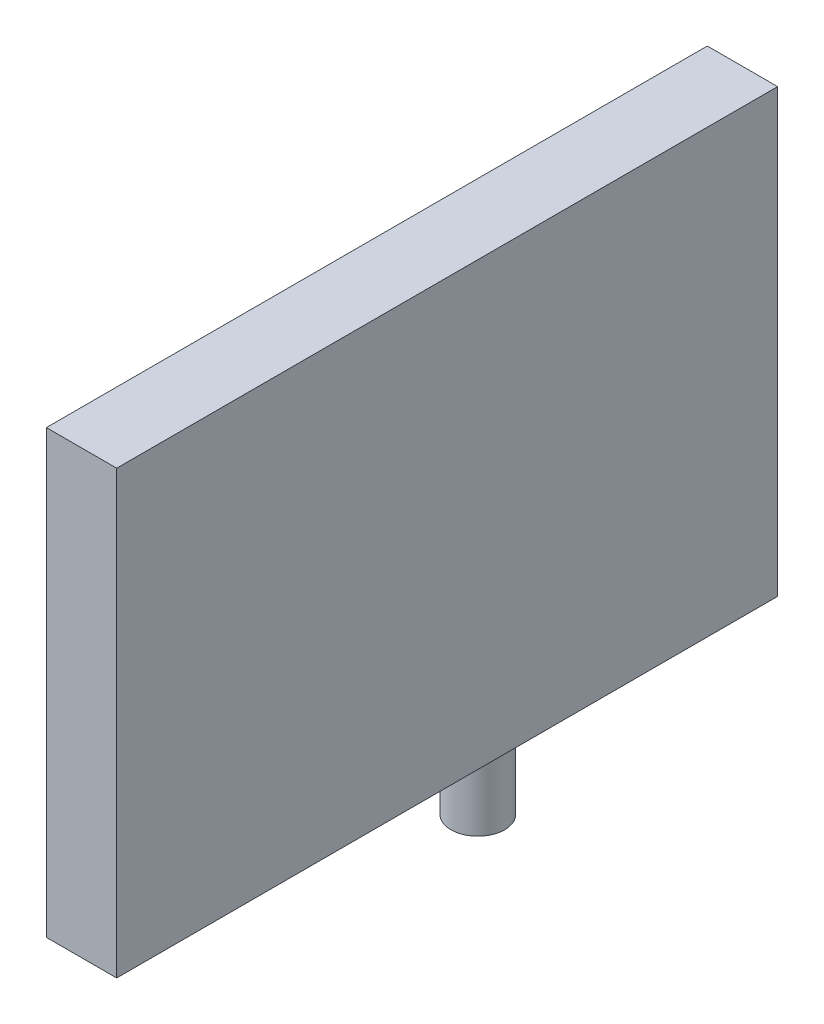
ISO-10303-21;
HEADER;
FILE_DESCRIPTION(('STEP AP214'),'2;1');
FILE_NAME('part.step','',(''),(''),'','','');
FILE_SCHEMA(('AUTOMOTIVE_DESIGN { 1 0 10303 214 1 1 1 1 }'));
ENDSEC;
DATA;
#1=APPLICATION_CONTEXT('core data for automotive mechanical design processes');
#2=APPLICATION_PROTOCOL_DEFINITION('international standard','automotive_design',2000,#1);
#3=PRODUCT_CONTEXT('',#1,'mechanical');
#4=PRODUCT('Part','Part','',(#3));
#5=PRODUCT_RELATED_PRODUCT_CATEGORY('part','',(#4));
#6=PRODUCT_DEFINITION_FORMATION('','',#4);
#7=PRODUCT_DEFINITION_CONTEXT('part definition',#1,'design');
#8=PRODUCT_DEFINITION('design','',#6,#7);
#9=PRODUCT_DEFINITION_SHAPE('','',#8);
#10=(LENGTH_UNIT() NAMED_UNIT(*) SI_UNIT(.MILLI.,.METRE.));
#11=(NAMED_UNIT(*) PLANE_ANGLE_UNIT() SI_UNIT($,.RADIAN.));
#12=(NAMED_UNIT(*) SI_UNIT($,.STERADIAN.) SOLID_ANGLE_UNIT());
#13=UNCERTAINTY_MEASURE_WITH_UNIT(LENGTH_MEASURE(1.E-05),#10,'distance_accuracy_value','');
#14=(GEOMETRIC_REPRESENTATION_CONTEXT(3) GLOBAL_UNCERTAINTY_ASSIGNED_CONTEXT((#13)) GLOBAL_UNIT_ASSIGNED_CONTEXT((#10,
#11,#12)) REPRESENTATION_CONTEXT('',''));
#15=CARTESIAN_POINT('',(0.,0.,0.));
#16=DIRECTION('',(0.,0.,1.));
#17=DIRECTION('',(1.,0.,0.));
#18=AXIS2_PLACEMENT_3D('',#15,#16,#17);
#19=CARTESIAN_POINT('',(10.,31.3958167330677,-46.9980100370033));
#20=DIRECTION('',(0.,0.,1.));
#21=DIRECTION('',(1.,0.,0.));
#22=AXIS2_PLACEMENT_3D('',#19,#20,#21);
#23=PLANE('',#22);
#24=DIRECTION('',(0.,1.,0.));
#25=VECTOR('',#24,1.);
#26=CARTESIAN_POINT('',(0.,31.3958167330677,-46.9980100370033));
#27=LINE('',#26,#25);
#28=CARTESIAN_POINT('',(0.,-31.3958167330677,-46.9980100370033));
#29=VERTEX_POINT('',#28);
#30=CARTESIAN_POINT('',(0.,31.3958167330677,-46.9980100370033));
#31=VERTEX_POINT('',#30);
#32=EDGE_CURVE('E99',#29,#31,#27,.T.);
#33=ORIENTED_EDGE('',*,*,#32,.T.);
#34=DIRECTION('',(-1.,0.,0.));
#35=VECTOR('',#34,1.);
#36=CARTESIAN_POINT('',(10.,31.3958167330677,-46.9980100370033));
#37=LINE('',#36,#35);
#38=CARTESIAN_POINT('',(10.,31.3958167330677,-46.9980100370033));
#39=VERTEX_POINT('',#38);
#40=EDGE_CURVE('E41',#39,#31,#37,.T.);
#41=ORIENTED_EDGE('',*,*,#40,.F.);
#42=DIRECTION('',(0.,1.,0.));
#43=VECTOR('',#42,1.);
#44=CARTESIAN_POINT('',(10.,31.3958167330677,-46.9980100370033));
#45=LINE('',#44,#43);
#46=CARTESIAN_POINT('',(10.,-31.3958167330677,-46.9980100370033));
#47=VERTEX_POINT('',#46);
#48=EDGE_CURVE('E85',#47,#39,#45,.T.);
#49=ORIENTED_EDGE('',*,*,#48,.F.);
#50=DIRECTION('',(-1.,0.,0.));
#51=VECTOR('',#50,1.);
#52=CARTESIAN_POINT('',(10.,-31.3958167330677,-46.9980100370033));
#53=LINE('',#52,#51);
#54=EDGE_CURVE('E95',#47,#29,#53,.T.);
#55=ORIENTED_EDGE('',*,*,#54,.T.);
#56=EDGE_LOOP('',(#33,#41,#49,#55));
#57=FACE_BOUND('',#56,.T.);
#58=ADVANCED_FACE('F33',(#57),#23,.F.);
#59=CARTESIAN_POINT('',(10.,31.3958167330677,46.9980100370033));
#60=DIRECTION('',(0.,-1.,0.));
#61=DIRECTION('',(0.,0.,-1.));
#62=AXIS2_PLACEMENT_3D('',#59,#60,#61);
#63=PLANE('',#62);
#64=DIRECTION('',(0.,0.,1.));
#65=VECTOR('',#64,1.);
#66=CARTESIAN_POINT('',(0.,31.3958167330677,46.9980100370033));
#67=LINE('',#66,#65);
#68=CARTESIAN_POINT('',(0.,31.3958167330677,46.9980100370033));
#69=VERTEX_POINT('',#68);
#70=EDGE_CURVE('E90',#31,#69,#67,.T.);
#71=ORIENTED_EDGE('',*,*,#70,.T.);
#72=DIRECTION('',(-1.,0.,0.));
#73=VECTOR('',#72,1.);
#74=CARTESIAN_POINT('',(10.,31.3958167330677,46.9980100370033));
#75=LINE('',#74,#73);
#76=CARTESIAN_POINT('',(10.,31.3958167330677,46.9980100370033));
#77=VERTEX_POINT('',#76);
#78=EDGE_CURVE('E88',#77,#69,#75,.T.);
#79=ORIENTED_EDGE('',*,*,#78,.F.);
#80=DIRECTION('',(0.,0.,1.));
#81=VECTOR('',#80,1.);
#82=CARTESIAN_POINT('',(10.,31.3958167330677,46.9980100370033));
#83=LINE('',#82,#81);
#84=EDGE_CURVE('E80',#39,#77,#83,.T.);
#85=ORIENTED_EDGE('',*,*,#84,.F.);
#86=ORIENTED_EDGE('',*,*,#40,.T.);
#87=EDGE_LOOP('',(#71,#79,#85,#86));
#88=FACE_BOUND('',#87,.T.);
#89=ADVANCED_FACE('F89',(#88),#63,.F.);
#90=CARTESIAN_POINT('',(10.,31.3958167330677,46.9980100370033));
#91=DIRECTION('',(0.,0.,-1.));
#92=DIRECTION('',(-1.,0.,0.));
#93=AXIS2_PLACEMENT_3D('',#90,#91,#92);
#94=PLANE('',#93);
#95=DIRECTION('',(0.,-1.,0.));
#96=VECTOR('',#95,1.);
#97=CARTESIAN_POINT('',(0.,31.3958167330677,46.9980100370033));
#98=LINE('',#97,#96);
#99=CARTESIAN_POINT('',(0.,-31.3958167330677,46.9980100370033));
#100=VERTEX_POINT('',#99);
#101=EDGE_CURVE('E66',#69,#100,#98,.T.);
#102=ORIENTED_EDGE('',*,*,#101,.T.);
#103=DIRECTION('',(-1.,0.,0.));
#104=VECTOR('',#103,1.);
#105=CARTESIAN_POINT('',(10.,-31.3958167330677,46.9980100370033));
#106=LINE('',#105,#104);
#107=CARTESIAN_POINT('',(10.,-31.3958167330677,46.9980100370033));
#108=VERTEX_POINT('',#107);
#109=EDGE_CURVE('E91',#108,#100,#106,.T.);
#110=ORIENTED_EDGE('',*,*,#109,.F.);
#111=DIRECTION('',(0.,-1.,0.));
#112=VECTOR('',#111,1.);
#113=CARTESIAN_POINT('',(10.,31.3958167330677,46.9980100370033));
#114=LINE('',#113,#112);
#115=EDGE_CURVE('E83',#77,#108,#114,.T.);
#116=ORIENTED_EDGE('',*,*,#115,.F.);
#117=ORIENTED_EDGE('',*,*,#78,.T.);
#118=EDGE_LOOP('',(#102,#110,#116,#117));
#119=FACE_BOUND('',#118,.T.);
#120=ADVANCED_FACE('F93',(#119),#94,.F.);
#121=CARTESIAN_POINT('',(10.,-31.3958167330677,46.9980100370033));
#122=DIRECTION('',(0.,1.,0.));
#123=DIRECTION('',(0.,0.,1.));
#124=AXIS2_PLACEMENT_3D('',#121,#122,#123);
#125=PLANE('',#124);
#126=CARTESIAN_POINT('',(5.52708882063868,-31.3958167330677,-8.83415734558923));
#127=DIRECTION('',(0.,1.,0.));
#128=DIRECTION('',(0.,0.,1.));
#129=AXIS2_PLACEMENT_3D('',#126,#127,#128);
#130=CIRCLE('',#129,3.81180802212379);
#131=CARTESIAN_POINT('',(5.52708882063868,-31.3958167330677,-5.02234932346545));
#132=VERTEX_POINT('',#131);
#133=EDGE_CURVE('E11',#132,#132,#130,.F.);
#134=ORIENTED_EDGE('',*,*,#133,.F.);
#135=EDGE_LOOP('',(#134));
#136=FACE_BOUND('',#135,.T.);
#137=DIRECTION('',(0.,0.,-1.));
#138=VECTOR('',#137,1.);
#139=CARTESIAN_POINT('',(0.,-31.3958167330677,46.9980100370033));
#140=LINE('',#139,#138);
#141=EDGE_CURVE('E72',#100,#29,#140,.T.);
#142=ORIENTED_EDGE('',*,*,#141,.T.);
#143=ORIENTED_EDGE('',*,*,#54,.F.);
#144=DIRECTION('',(0.,0.,-1.));
#145=VECTOR('',#144,1.);
#146=CARTESIAN_POINT('',(10.,-31.3958167330677,46.9980100370033));
#147=LINE('',#146,#145);
#148=EDGE_CURVE('E49',#108,#47,#147,.T.);
#149=ORIENTED_EDGE('',*,*,#148,.F.);
#150=ORIENTED_EDGE('',*,*,#109,.T.);
#151=EDGE_LOOP('',(#142,#143,#149,#150));
#152=FACE_BOUND('',#151,.T.);
#153=ADVANCED_FACE('F121',(#136,#152),#125,.F.);
#154=CARTESIAN_POINT('',(10.,0.,0.));
#155=DIRECTION('',(1.,0.,0.));
#156=DIRECTION('',(0.,0.,-1.));
#157=AXIS2_PLACEMENT_3D('',#154,#155,#156);
#158=PLANE('',#157);
#159=ORIENTED_EDGE('',*,*,#48,.T.);
#160=ORIENTED_EDGE('',*,*,#84,.T.);
#161=ORIENTED_EDGE('',*,*,#115,.T.);
#162=ORIENTED_EDGE('',*,*,#148,.T.);
#163=EDGE_LOOP('',(#159,#160,#161,#162));
#164=FACE_BOUND('',#163,.T.);
#165=ADVANCED_FACE('F81',(#164),#158,.T.);
#166=CARTESIAN_POINT('',(0.,0.,0.));
#167=DIRECTION('',(1.,0.,0.));
#168=DIRECTION('',(0.,0.,-1.));
#169=AXIS2_PLACEMENT_3D('',#166,#167,#168);
#170=PLANE('',#169);
#171=ORIENTED_EDGE('',*,*,#32,.F.);
#172=ORIENTED_EDGE('',*,*,#141,.F.);
#173=ORIENTED_EDGE('',*,*,#101,.F.);
#174=ORIENTED_EDGE('',*,*,#70,.F.);
#175=EDGE_LOOP('',(#171,#172,#173,#174));
#176=FACE_BOUND('',#175,.T.);
#177=ADVANCED_FACE('F110',(#176),#170,.F.);
#178=CARTESIAN_POINT('',(5.52708882063868,-41.3958167330677,-8.83415734558923));
#179=DIRECTION('',(0.,1.,0.));
#180=DIRECTION('',(0.,0.,1.));
#181=AXIS2_PLACEMENT_3D('',#178,#179,#180);
#182=CYLINDRICAL_SURFACE('',#181,3.81180802212379);
#183=CARTESIAN_POINT('',(5.52708882063868,-41.3958167330677,-8.83415734558923));
#184=DIRECTION('',(0.,-1.,0.));
#185=DIRECTION('',(0.,0.,-1.));
#186=AXIS2_PLACEMENT_3D('',#183,#184,#185);
#187=CIRCLE('',#186,3.81180802212379);
#188=CARTESIAN_POINT('',(5.52708882063868,-41.3958167330677,-12.645965367713));
#189=VERTEX_POINT('',#188);
#190=EDGE_CURVE('E102',#189,#189,#187,.T.);
#191=ORIENTED_EDGE('',*,*,#190,.F.);
#192=EDGE_LOOP('',(#191));
#193=FACE_BOUND('',#192,.T.);
#194=ORIENTED_EDGE('',*,*,#133,.T.);
#195=EDGE_LOOP('',(#194));
#196=FACE_BOUND('',#195,.T.);
#197=ADVANCED_FACE('F112',(#193,#196),#182,.T.);
#198=CARTESIAN_POINT('',(5.52708882063868,-41.3958167330677,-8.83415734558923));
#199=DIRECTION('',(0.,-1.,0.));
#200=DIRECTION('',(0.,0.,-1.));
#201=AXIS2_PLACEMENT_3D('',#198,#199,#200);
#202=PLANE('',#201);
#203=ORIENTED_EDGE('',*,*,#190,.T.);
#204=EDGE_LOOP('',(#203));
#205=FACE_BOUND('',#204,.T.);
#206=ADVANCED_FACE('F118',(#205),#202,.T.);
#207=CLOSED_SHELL('',(#58,#89,#120,#153,#165,#177,#197,#206));
#208=MANIFOLD_SOLID_BREP('B2',#207);
#209=ADVANCED_BREP_SHAPE_REPRESENTATION('',(#18,#208),#14);
#210=SHAPE_DEFINITION_REPRESENTATION(#9,#209);
ENDSEC;
END-ISO-10303-21;
